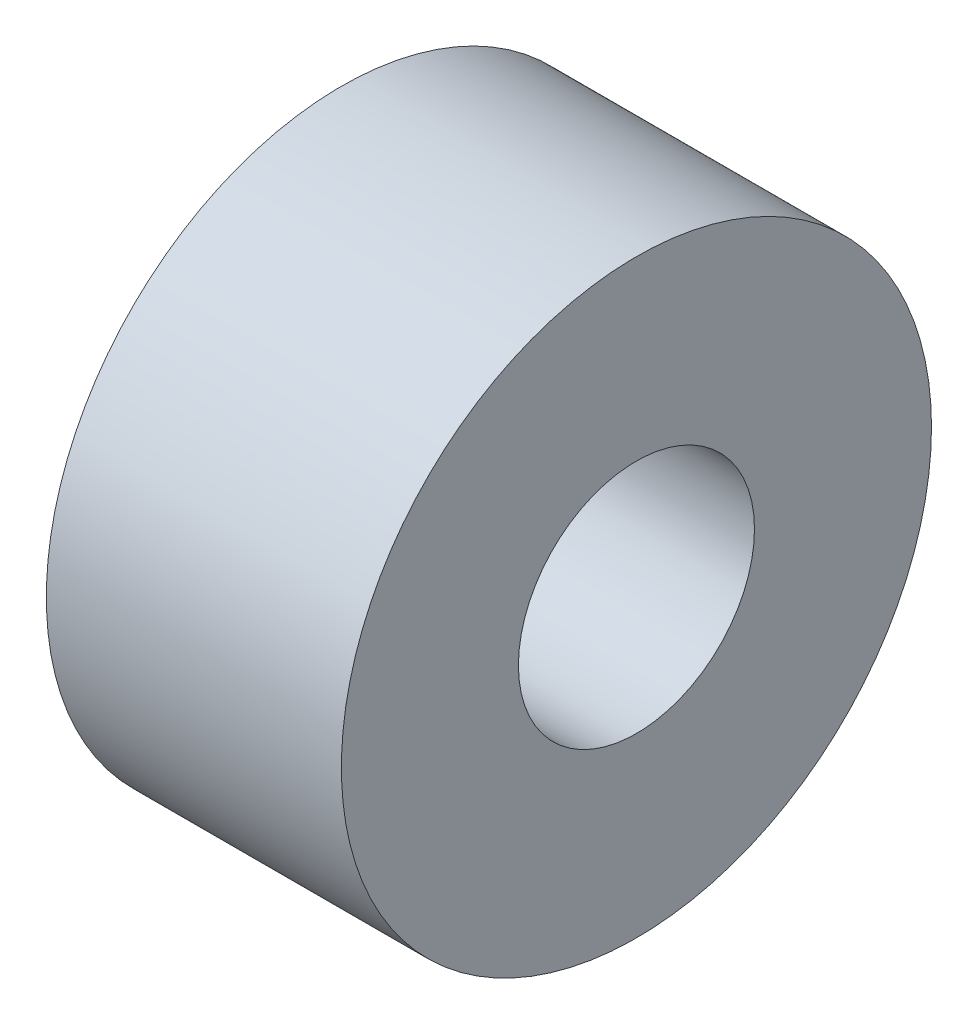
ISO-10303-21;
HEADER;
FILE_DESCRIPTION(('STEP AP214'),'2;1');
FILE_NAME('part.step','',(''),(''),'','','');
FILE_SCHEMA(('AUTOMOTIVE_DESIGN { 1 0 10303 214 1 1 1 1 }'));
ENDSEC;
DATA;
#1=APPLICATION_CONTEXT('core data for automotive mechanical design processes');
#2=APPLICATION_PROTOCOL_DEFINITION('international standard','automotive_design',2000,#1);
#3=PRODUCT_CONTEXT('',#1,'mechanical');
#4=PRODUCT('Part','Part','',(#3));
#5=PRODUCT_RELATED_PRODUCT_CATEGORY('part','',(#4));
#6=PRODUCT_DEFINITION_FORMATION('','',#4);
#7=PRODUCT_DEFINITION_CONTEXT('part definition',#1,'design');
#8=PRODUCT_DEFINITION('design','',#6,#7);
#9=PRODUCT_DEFINITION_SHAPE('','',#8);
#10=(LENGTH_UNIT() NAMED_UNIT(*) SI_UNIT(.MILLI.,.METRE.));
#11=(NAMED_UNIT(*) PLANE_ANGLE_UNIT() SI_UNIT($,.RADIAN.));
#12=(NAMED_UNIT(*) SI_UNIT($,.STERADIAN.) SOLID_ANGLE_UNIT());
#13=UNCERTAINTY_MEASURE_WITH_UNIT(LENGTH_MEASURE(1.E-05),#10,'distance_accuracy_value','');
#14=(GEOMETRIC_REPRESENTATION_CONTEXT(3) GLOBAL_UNCERTAINTY_ASSIGNED_CONTEXT((#13)) GLOBAL_UNIT_ASSIGNED_CONTEXT((#10,
#11,#12)) REPRESENTATION_CONTEXT('',''));
#15=CARTESIAN_POINT('',(0.,0.,0.));
#16=DIRECTION('',(0.,0.,1.));
#17=DIRECTION('',(1.,0.,0.));
#18=AXIS2_PLACEMENT_3D('',#15,#16,#17);
#19=CARTESIAN_POINT('',(2.5,0.,0.));
#20=DIRECTION('',(1.,0.,0.));
#21=DIRECTION('',(0.,0.,-1.));
#22=AXIS2_PLACEMENT_3D('',#19,#20,#21);
#23=PLANE('',#22);
#24=CARTESIAN_POINT('',(2.5,0.,0.));
#25=DIRECTION('',(1.,0.,0.));
#26=DIRECTION('',(0.,0.,-1.));
#27=AXIS2_PLACEMENT_3D('',#24,#25,#26);
#28=CIRCLE('',#27,2.5);
#29=CARTESIAN_POINT('',(2.5,0.,-2.5));
#30=VERTEX_POINT('',#29);
#31=EDGE_CURVE('E10',#30,#30,#28,.T.);
#32=ORIENTED_EDGE('',*,*,#31,.T.);
#33=EDGE_LOOP('',(#32));
#34=FACE_BOUND('',#33,.T.);
#35=CARTESIAN_POINT('',(2.5,0.,0.));
#36=DIRECTION('',(1.,0.,0.));
#37=DIRECTION('',(0.,0.,-1.));
#38=AXIS2_PLACEMENT_3D('',#35,#36,#37);
#39=CIRCLE('',#38,1.);
#40=CARTESIAN_POINT('',(2.5,0.,-1.));
#41=VERTEX_POINT('',#40);
#42=EDGE_CURVE('E48',#41,#41,#39,.T.);
#43=ORIENTED_EDGE('',*,*,#42,.F.);
#44=EDGE_LOOP('',(#43));
#45=FACE_BOUND('',#44,.T.);
#46=ADVANCED_FACE('F37',(#34,#45),#23,.T.);
#47=CARTESIAN_POINT('',(0.,0.,0.));
#48=DIRECTION('',(1.,0.,0.));
#49=DIRECTION('',(0.,0.,-1.));
#50=AXIS2_PLACEMENT_3D('',#47,#48,#49);
#51=PLANE('',#50);
#52=CARTESIAN_POINT('',(0.,0.,0.));
#53=DIRECTION('',(1.,0.,0.));
#54=DIRECTION('',(0.,0.,-1.));
#55=AXIS2_PLACEMENT_3D('',#52,#53,#54);
#56=CIRCLE('',#55,2.5);
#57=CARTESIAN_POINT('',(0.,0.,-2.5));
#58=VERTEX_POINT('',#57);
#59=EDGE_CURVE('E41',#58,#58,#56,.T.);
#60=ORIENTED_EDGE('',*,*,#59,.F.);
#61=EDGE_LOOP('',(#60));
#62=FACE_BOUND('',#61,.T.);
#63=CARTESIAN_POINT('',(0.,0.,0.));
#64=DIRECTION('',(1.,0.,0.));
#65=DIRECTION('',(0.,0.,-1.));
#66=AXIS2_PLACEMENT_3D('',#63,#64,#65);
#67=CIRCLE('',#66,1.);
#68=CARTESIAN_POINT('',(0.,0.,-1.));
#69=VERTEX_POINT('',#68);
#70=EDGE_CURVE('E50',#69,#69,#67,.T.);
#71=ORIENTED_EDGE('',*,*,#70,.T.);
#72=EDGE_LOOP('',(#71));
#73=FACE_BOUND('',#72,.T.);
#74=ADVANCED_FACE('F60',(#62,#73),#51,.F.);
#75=CARTESIAN_POINT('',(2.5,0.,0.));
#76=DIRECTION('',(-1.,0.,0.));
#77=DIRECTION('',(0.,0.,1.));
#78=AXIS2_PLACEMENT_3D('',#75,#76,#77);
#79=CYLINDRICAL_SURFACE('',#78,2.5);
#80=ORIENTED_EDGE('',*,*,#31,.F.);
#81=EDGE_LOOP('',(#80));
#82=FACE_BOUND('',#81,.T.);
#83=ORIENTED_EDGE('',*,*,#59,.T.);
#84=EDGE_LOOP('',(#83));
#85=FACE_BOUND('',#84,.T.);
#86=ADVANCED_FACE('F39',(#82,#85),#79,.T.);
#87=CARTESIAN_POINT('',(2.5,0.,0.));
#88=DIRECTION('',(-1.,0.,0.));
#89=DIRECTION('',(0.,0.,1.));
#90=AXIS2_PLACEMENT_3D('',#87,#88,#89);
#91=CYLINDRICAL_SURFACE('',#90,1.);
#92=ORIENTED_EDGE('',*,*,#42,.T.);
#93=EDGE_LOOP('',(#92));
#94=FACE_BOUND('',#93,.T.);
#95=ORIENTED_EDGE('',*,*,#70,.F.);
#96=EDGE_LOOP('',(#95));
#97=FACE_BOUND('',#96,.T.);
#98=ADVANCED_FACE('F56',(#94,#97),#91,.F.);
#99=CLOSED_SHELL('',(#46,#74,#86,#98));
#100=MANIFOLD_SOLID_BREP('B2',#99);
#101=ADVANCED_BREP_SHAPE_REPRESENTATION('',(#18,#100),#14);
#102=SHAPE_DEFINITION_REPRESENTATION(#9,#101);
ENDSEC;
END-ISO-10303-21;
